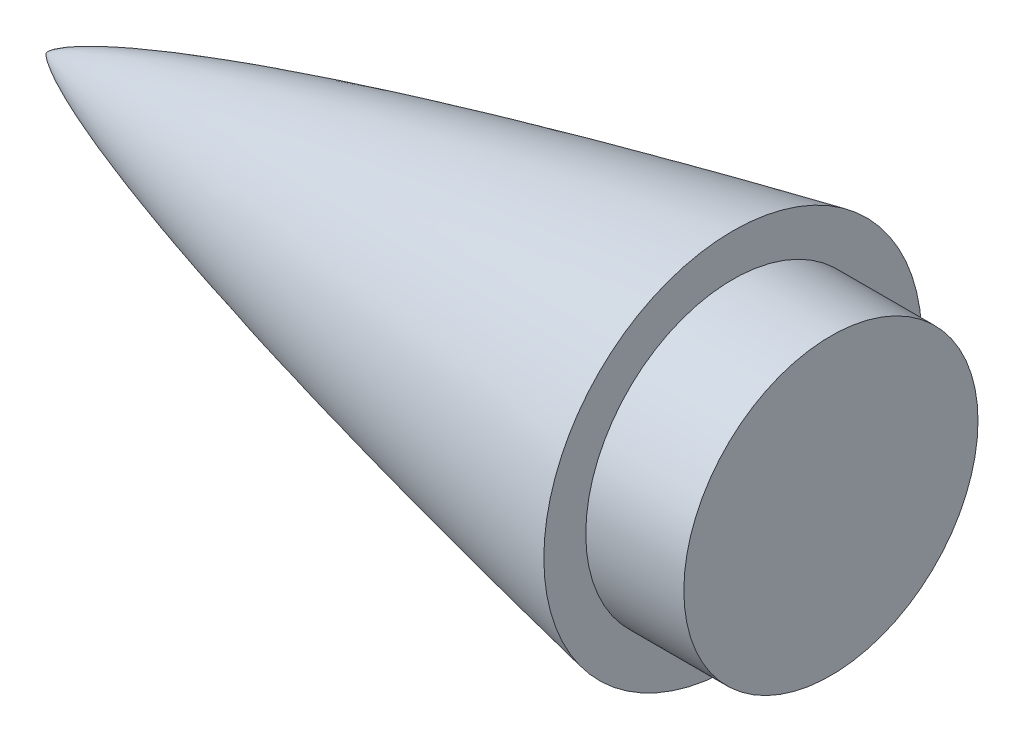
ISO-10303-21;
HEADER;
FILE_DESCRIPTION(('STEP AP214'),'2;1');
FILE_NAME('part.step','',(''),(''),'','','');
FILE_SCHEMA(('AUTOMOTIVE_DESIGN { 1 0 10303 214 1 1 1 1 }'));
ENDSEC;
DATA;
#1=APPLICATION_CONTEXT('core data for automotive mechanical design processes');
#2=APPLICATION_PROTOCOL_DEFINITION('international standard','automotive_design',2000,#1);
#3=PRODUCT_CONTEXT('',#1,'mechanical');
#4=PRODUCT('Part','Part','',(#3));
#5=PRODUCT_RELATED_PRODUCT_CATEGORY('part','',(#4));
#6=PRODUCT_DEFINITION_FORMATION('','',#4);
#7=PRODUCT_DEFINITION_CONTEXT('part definition',#1,'design');
#8=PRODUCT_DEFINITION('design','',#6,#7);
#9=PRODUCT_DEFINITION_SHAPE('','',#8);
#10=(LENGTH_UNIT() NAMED_UNIT(*) SI_UNIT(.MILLI.,.METRE.));
#11=(NAMED_UNIT(*) PLANE_ANGLE_UNIT() SI_UNIT($,.RADIAN.));
#12=(NAMED_UNIT(*) SI_UNIT($,.STERADIAN.) SOLID_ANGLE_UNIT());
#13=UNCERTAINTY_MEASURE_WITH_UNIT(LENGTH_MEASURE(1.E-05),#10,'distance_accuracy_value','');
#14=(GEOMETRIC_REPRESENTATION_CONTEXT(3) GLOBAL_UNCERTAINTY_ASSIGNED_CONTEXT((#13)) GLOBAL_UNIT_ASSIGNED_CONTEXT((#10,
#11,#12)) REPRESENTATION_CONTEXT('',''));
#15=CARTESIAN_POINT('',(0.,0.,0.));
#16=DIRECTION('',(0.,0.,1.));
#17=DIRECTION('',(1.,0.,0.));
#18=AXIS2_PLACEMENT_3D('',#15,#16,#17);
#19=CARTESIAN_POINT('',(44.4500000001276,12.2403780411913,0.));
#20=CARTESIAN_POINT('',(43.6788006632696,12.0864445537193,0.));
#21=CARTESIAN_POINT('',(42.141706028335,11.7769431060158,0.));
#22=CARTESIAN_POINT('',(39.1374851972192,11.1648544234338,0.));
#23=CARTESIAN_POINT('',(36.1346382600951,10.530595732064,0.));
#24=CARTESIAN_POINT('',(32.5312271923052,9.75633427389506,0.));
#25=CARTESIAN_POINT('',(29.2981497278966,9.03364845780258,0.));
#26=CARTESIAN_POINT('',(25.8485751509928,8.24258304265388,0.));
#27=CARTESIAN_POINT('',(22.5404308490252,7.45104445625214,0.));
#28=CARTESIAN_POINT('',(19.1577013595025,6.61110028465584,0.));
#29=CARTESIAN_POINT('',(15.8351683774169,5.74326247050488,0.));
#30=CARTESIAN_POINT('',(12.4936826338768,4.82207604138872,0.));
#31=CARTESIAN_POINT('',(9.22641349996018,3.85530066756865,0.));
#32=CARTESIAN_POINT('',(6.38160109753216,2.93589634248055,0.));
#33=CARTESIAN_POINT('',(4.0929505904555,2.11124740726346,0.));
#34=CARTESIAN_POINT('',(2.46279613712294,1.44279331280701,0.));
#35=CARTESIAN_POINT('',(1.51138898745607,1.00171877352215,0.));
#36=CARTESIAN_POINT('',(0.901635525847259,0.680174208203376,0.));
#37=CARTESIAN_POINT('',(0.544576148645883,0.465759826182981,0.));
#38=CARTESIAN_POINT('',(0.332159509315707,0.321448771594365,0.));
#39=CARTESIAN_POINT('',(0.205163795354978,0.223773559570056,0.));
#40=CARTESIAN_POINT('',(0.128401711956188,0.157512982085054,0.));
#41=CARTESIAN_POINT('',(0.0811094624147282,0.111493123977777,0.));
#42=CARTESIAN_POINT('',(0.0495842936067654,0.0773382435937036,0.));
#43=CARTESIAN_POINT('',(0.0258665297583861,0.047678001636309,0.));
#44=CARTESIAN_POINT('',(0.0105511334225584,0.0262748295683498,0.));
#45=CARTESIAN_POINT('',(0.00301199312584974,0.00976290506836826,0.));
#46=CARTESIAN_POINT('',(0.,0.,0.));
#47=B_SPLINE_CURVE_WITH_KNOTS('',4,(#19,#20,#21,#22,#23,#24,#25,#26,#27,#28,#29,#30,#31,#32,#33,
#34,#35,#36,#37,#38,#39,#40,#41,#42,#43,#44,#45,#46),.UNSPECIFIED.,.F.,.F.,(5,1,1,1,1,1,1,1,1,1,
1,1,1,1,1,1,1,1,1,1,1,1,1,1,5),(0.,0.0679699247571307,0.135939850099123,0.203909775678574,
0.271879701238029,0.339849626927576,0.407819554174716,0.475789477512958,0.543759405723729,
0.611729329084798,0.679699256257167,0.747669172248057,0.812633032457565,0.846617954452944,
0.871417624482987,0.886197237326969,0.8952316854441,0.900819023365049,0.904212610405943,
0.906389882935161,0.907845489034672,0.908792492345662,0.909409182631141,0.910041707231012,
0.910842976088599),.UNSPECIFIED.);
#48=CARTESIAN_POINT('',(0.,0.,0.));
#49=DIRECTION('',(-1.,0.,0.));
#50=AXIS1_PLACEMENT('',#48,#49);
#51=SURFACE_OF_REVOLUTION('',#47,#50);
#52=CARTESIAN_POINT('',(0.,0.,0.));
#53=VERTEX_POINT('',#52);
#54=VERTEX_LOOP('',#53);
#55=FACE_BOUND('',#54,.T.);
#56=CARTESIAN_POINT('',(44.4500000002697,0.,0.));
#57=DIRECTION('',(-1.,0.,0.));
#58=DIRECTION('',(0.,0.,1.));
#59=AXIS2_PLACEMENT_3D('',#56,#57,#58);
#60=CIRCLE('',#59,12.2403780412196);
#61=CARTESIAN_POINT('',(44.4500000002697,0.,12.2403780412196));
#62=VERTEX_POINT('',#61);
#63=EDGE_CURVE('E52',#62,#62,#60,.T.);
#64=ORIENTED_EDGE('',*,*,#63,.T.);
#65=EDGE_LOOP('',(#64));
#66=FACE_BOUND('',#65,.T.);
#67=ADVANCED_FACE('F37',(#55,#66),#51,.T.);
#68=CARTESIAN_POINT('',(50.8000000002697,9.525,0.));
#69=DIRECTION('',(-1.,0.,0.));
#70=DIRECTION('',(0.,0.,1.));
#71=AXIS2_PLACEMENT_3D('',#68,#69,#70);
#72=PLANE('',#71);
#73=CARTESIAN_POINT('',(50.8000000002697,0.,0.));
#74=DIRECTION('',(-1.,0.,0.));
#75=DIRECTION('',(0.,0.,1.));
#76=AXIS2_PLACEMENT_3D('',#73,#74,#75);
#77=CIRCLE('',#76,9.525);
#78=CARTESIAN_POINT('',(50.8000000002697,0.,9.525));
#79=VERTEX_POINT('',#78);
#80=EDGE_CURVE('E11',#79,#79,#77,.T.);
#81=ORIENTED_EDGE('',*,*,#80,.F.);
#82=EDGE_LOOP('',(#81));
#83=FACE_BOUND('',#82,.T.);
#84=ADVANCED_FACE('F49',(#83),#72,.F.);
#85=CARTESIAN_POINT('',(0.,0.,0.));
#86=DIRECTION('',(-1.,0.,0.));
#87=DIRECTION('',(0.,0.,1.));
#88=AXIS2_PLACEMENT_3D('',#85,#86,#87);
#89=CYLINDRICAL_SURFACE('',#88,9.525);
#90=CARTESIAN_POINT('',(44.4500000002697,0.,0.));
#91=DIRECTION('',(-1.,0.,0.));
#92=DIRECTION('',(0.,0.,1.));
#93=AXIS2_PLACEMENT_3D('',#90,#91,#92);
#94=CIRCLE('',#93,9.525);
#95=CARTESIAN_POINT('',(44.4500000002697,0.,9.525));
#96=VERTEX_POINT('',#95);
#97=EDGE_CURVE('E44',#96,#96,#94,.T.);
#98=ORIENTED_EDGE('',*,*,#97,.F.);
#99=EDGE_LOOP('',(#98));
#100=FACE_BOUND('',#99,.T.);
#101=ORIENTED_EDGE('',*,*,#80,.T.);
#102=EDGE_LOOP('',(#101));
#103=FACE_BOUND('',#102,.T.);
#104=ADVANCED_FACE('F66',(#100,#103),#89,.T.);
#105=CARTESIAN_POINT('',(44.4500000002697,9.525,0.));
#106=DIRECTION('',(-1.,0.,0.));
#107=DIRECTION('',(0.,0.,1.));
#108=AXIS2_PLACEMENT_3D('',#105,#106,#107);
#109=PLANE('',#108);
#110=ORIENTED_EDGE('',*,*,#63,.F.);
#111=EDGE_LOOP('',(#110));
#112=FACE_BOUND('',#111,.T.);
#113=ORIENTED_EDGE('',*,*,#97,.T.);
#114=EDGE_LOOP('',(#113));
#115=FACE_BOUND('',#114,.T.);
#116=ADVANCED_FACE('F64',(#112,#115),#109,.F.);
#117=CLOSED_SHELL('',(#67,#84,#104,#116));
#118=MANIFOLD_SOLID_BREP('B2',#117);
#119=ADVANCED_BREP_SHAPE_REPRESENTATION('',(#18,#118),#14);
#120=SHAPE_DEFINITION_REPRESENTATION(#9,#119);
ENDSEC;
END-ISO-10303-21;
